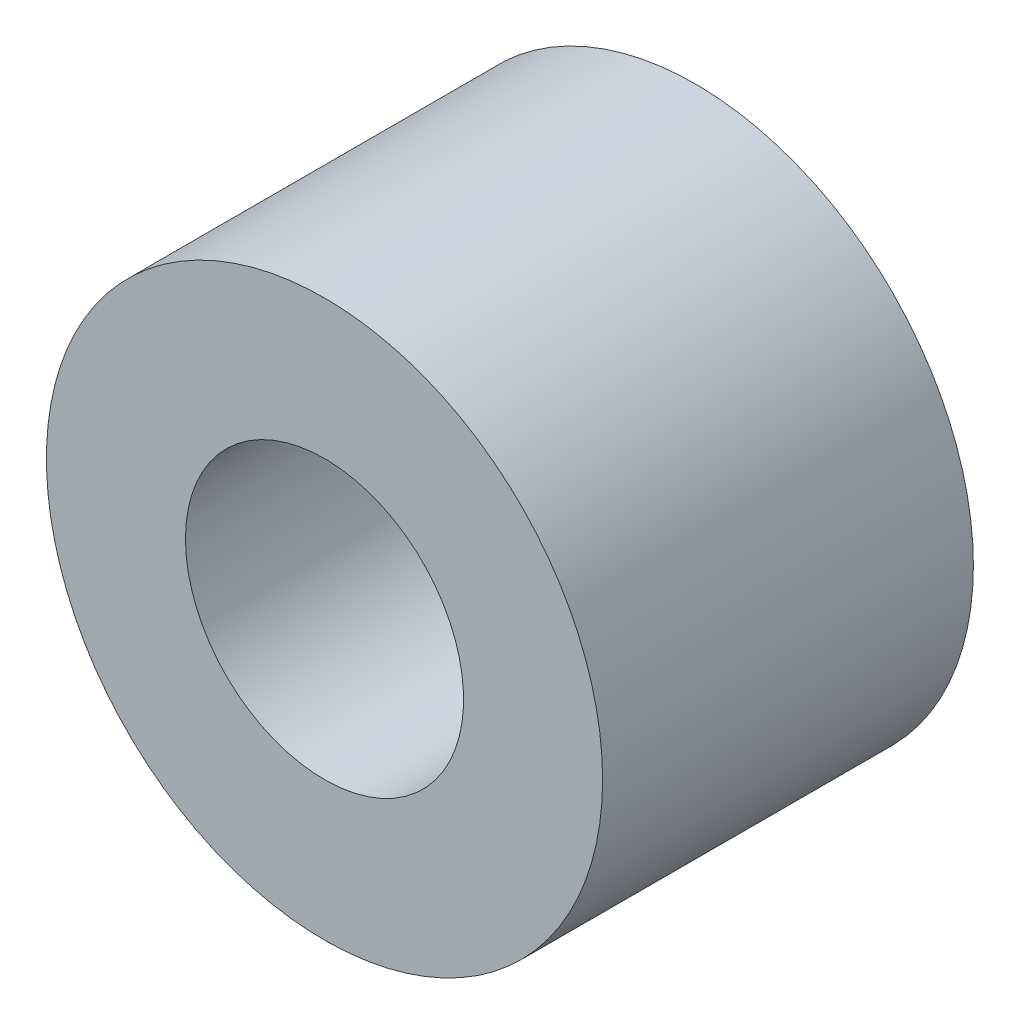
ISO-10303-21;
HEADER;
FILE_DESCRIPTION(('STEP AP214'),'2;1');
FILE_NAME('part.step','',(''),(''),'','','');
FILE_SCHEMA(('AUTOMOTIVE_DESIGN { 1 0 10303 214 1 1 1 1 }'));
ENDSEC;
DATA;
#1=APPLICATION_CONTEXT('core data for automotive mechanical design processes');
#2=APPLICATION_PROTOCOL_DEFINITION('international standard','automotive_design',2000,#1);
#3=PRODUCT_CONTEXT('',#1,'mechanical');
#4=PRODUCT('Part','Part','',(#3));
#5=PRODUCT_RELATED_PRODUCT_CATEGORY('part','',(#4));
#6=PRODUCT_DEFINITION_FORMATION('','',#4);
#7=PRODUCT_DEFINITION_CONTEXT('part definition',#1,'design');
#8=PRODUCT_DEFINITION('design','',#6,#7);
#9=PRODUCT_DEFINITION_SHAPE('','',#8);
#10=(LENGTH_UNIT() NAMED_UNIT(*) SI_UNIT(.MILLI.,.METRE.));
#11=(NAMED_UNIT(*) PLANE_ANGLE_UNIT() SI_UNIT($,.RADIAN.));
#12=(NAMED_UNIT(*) SI_UNIT($,.STERADIAN.) SOLID_ANGLE_UNIT());
#13=UNCERTAINTY_MEASURE_WITH_UNIT(LENGTH_MEASURE(1.E-05),#10,'distance_accuracy_value','');
#14=(GEOMETRIC_REPRESENTATION_CONTEXT(3) GLOBAL_UNCERTAINTY_ASSIGNED_CONTEXT((#13)) GLOBAL_UNIT_ASSIGNED_CONTEXT((#10,
#11,#12)) REPRESENTATION_CONTEXT('',''));
#15=CARTESIAN_POINT('',(0.,0.,0.));
#16=DIRECTION('',(0.,0.,1.));
#17=DIRECTION('',(1.,0.,0.));
#18=AXIS2_PLACEMENT_3D('',#15,#16,#17);
#19=CARTESIAN_POINT('',(0.,0.,4.));
#20=DIRECTION('',(0.,0.,-1.));
#21=DIRECTION('',(-1.,0.,0.));
#22=AXIS2_PLACEMENT_3D('',#19,#20,#21);
#23=CYLINDRICAL_SURFACE('',#22,3.);
#24=CARTESIAN_POINT('',(0.,0.,4.));
#25=DIRECTION('',(0.,0.,1.));
#26=DIRECTION('',(1.,0.,0.));
#27=AXIS2_PLACEMENT_3D('',#24,#25,#26);
#28=CIRCLE('',#27,3.);
#29=CARTESIAN_POINT('',(3.,0.,4.));
#30=VERTEX_POINT('',#29);
#31=EDGE_CURVE('E10',#30,#30,#28,.T.);
#32=ORIENTED_EDGE('',*,*,#31,.F.);
#33=EDGE_LOOP('',(#32));
#34=FACE_BOUND('',#33,.T.);
#35=CARTESIAN_POINT('',(0.,0.,0.));
#36=DIRECTION('',(0.,0.,1.));
#37=DIRECTION('',(1.,0.,0.));
#38=AXIS2_PLACEMENT_3D('',#35,#36,#37);
#39=CIRCLE('',#38,3.);
#40=CARTESIAN_POINT('',(3.,0.,0.));
#41=VERTEX_POINT('',#40);
#42=EDGE_CURVE('E36',#41,#41,#39,.T.);
#43=ORIENTED_EDGE('',*,*,#42,.T.);
#44=EDGE_LOOP('',(#43));
#45=FACE_BOUND('',#44,.T.);
#46=ADVANCED_FACE('F33',(#34,#45),#23,.T.);
#47=CARTESIAN_POINT('',(0.,0.,4.));
#48=DIRECTION('',(0.,0.,1.));
#49=DIRECTION('',(1.,0.,0.));
#50=AXIS2_PLACEMENT_3D('',#47,#48,#49);
#51=PLANE('',#50);
#52=CARTESIAN_POINT('',(0.,0.,4.));
#53=DIRECTION('',(0.,0.,-1.));
#54=DIRECTION('',(-1.,0.,0.));
#55=AXIS2_PLACEMENT_3D('',#52,#53,#54);
#56=CIRCLE('',#55,1.5);
#57=CARTESIAN_POINT('',(-1.5,0.,4.));
#58=VERTEX_POINT('',#57);
#59=EDGE_CURVE('E43',#58,#58,#56,.T.);
#60=ORIENTED_EDGE('',*,*,#59,.T.);
#61=EDGE_LOOP('',(#60));
#62=FACE_BOUND('',#61,.T.);
#63=ORIENTED_EDGE('',*,*,#31,.T.);
#64=EDGE_LOOP('',(#63));
#65=FACE_BOUND('',#64,.T.);
#66=ADVANCED_FACE('F51',(#62,#65),#51,.T.);
#67=CARTESIAN_POINT('',(0.,0.,0.));
#68=DIRECTION('',(0.,0.,1.));
#69=DIRECTION('',(1.,0.,0.));
#70=AXIS2_PLACEMENT_3D('',#67,#68,#69);
#71=PLANE('',#70);
#72=CARTESIAN_POINT('',(0.,0.,0.));
#73=DIRECTION('',(0.,0.,-1.));
#74=DIRECTION('',(-1.,0.,0.));
#75=AXIS2_PLACEMENT_3D('',#72,#73,#74);
#76=CIRCLE('',#75,1.5);
#77=CARTESIAN_POINT('',(-1.5,0.,0.));
#78=VERTEX_POINT('',#77);
#79=EDGE_CURVE('E45',#78,#78,#76,.T.);
#80=ORIENTED_EDGE('',*,*,#79,.F.);
#81=EDGE_LOOP('',(#80));
#82=FACE_BOUND('',#81,.T.);
#83=ORIENTED_EDGE('',*,*,#42,.F.);
#84=EDGE_LOOP('',(#83));
#85=FACE_BOUND('',#84,.T.);
#86=ADVANCED_FACE('F56',(#82,#85),#71,.F.);
#87=CARTESIAN_POINT('',(0.,0.,4.));
#88=DIRECTION('',(0.,0.,-1.));
#89=DIRECTION('',(-1.,0.,0.));
#90=AXIS2_PLACEMENT_3D('',#87,#88,#89);
#91=CYLINDRICAL_SURFACE('',#90,1.5);
#92=ORIENTED_EDGE('',*,*,#59,.F.);
#93=EDGE_LOOP('',(#92));
#94=FACE_BOUND('',#93,.T.);
#95=ORIENTED_EDGE('',*,*,#79,.T.);
#96=EDGE_LOOP('',(#95));
#97=FACE_BOUND('',#96,.T.);
#98=ADVANCED_FACE('F53',(#94,#97),#91,.F.);
#99=CLOSED_SHELL('',(#46,#66,#86,#98));
#100=MANIFOLD_SOLID_BREP('B2',#99);
#101=ADVANCED_BREP_SHAPE_REPRESENTATION('',(#18,#100),#14);
#102=SHAPE_DEFINITION_REPRESENTATION(#9,#101);
ENDSEC;
END-ISO-10303-21;
